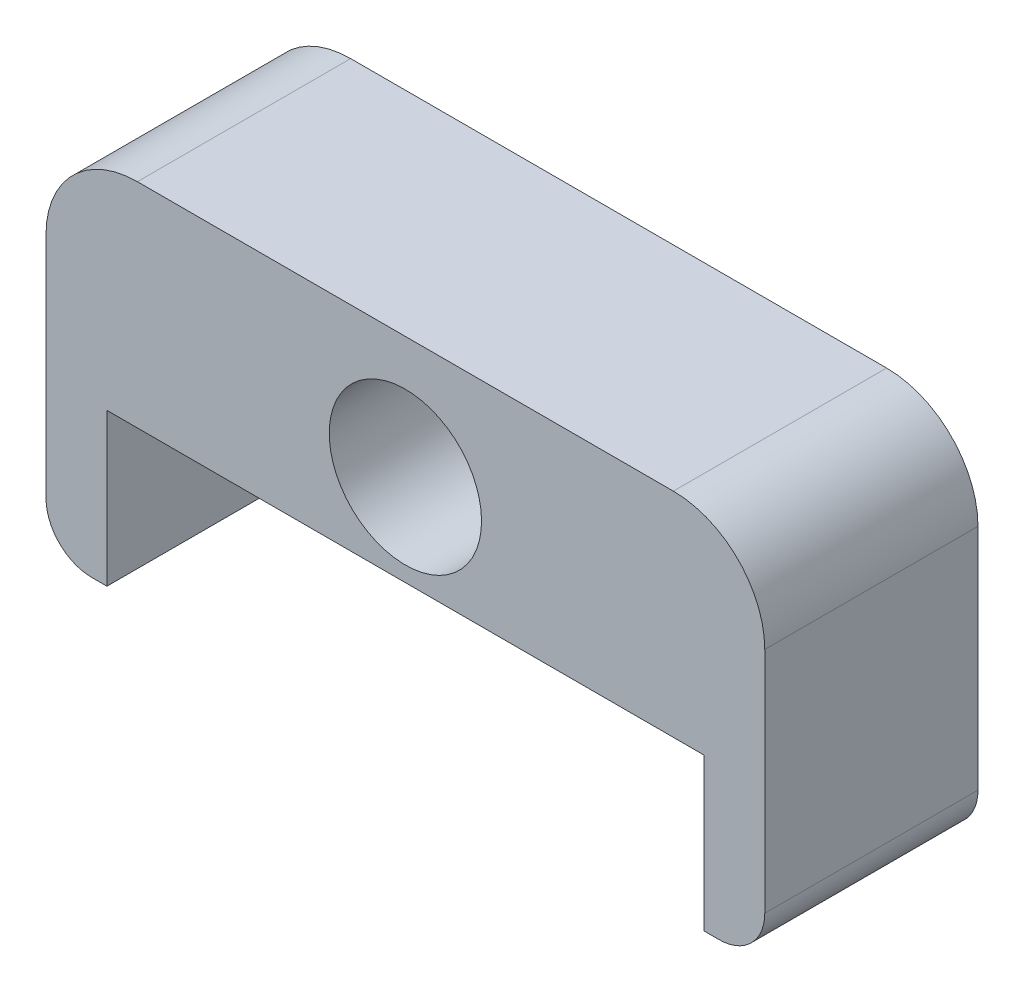
ISO-10303-21;
HEADER;
FILE_DESCRIPTION(('STEP AP214'),'2;1');
FILE_NAME('part.step','',(''),(''),'','','');
FILE_SCHEMA(('AUTOMOTIVE_DESIGN { 1 0 10303 214 1 1 1 1 }'));
ENDSEC;
DATA;
#1=APPLICATION_CONTEXT('core data for automotive mechanical design processes');
#2=APPLICATION_PROTOCOL_DEFINITION('international standard','automotive_design',2000,#1);
#3=PRODUCT_CONTEXT('',#1,'mechanical');
#4=PRODUCT('Part','Part','',(#3));
#5=PRODUCT_RELATED_PRODUCT_CATEGORY('part','',(#4));
#6=PRODUCT_DEFINITION_FORMATION('','',#4);
#7=PRODUCT_DEFINITION_CONTEXT('part definition',#1,'design');
#8=PRODUCT_DEFINITION('design','',#6,#7);
#9=PRODUCT_DEFINITION_SHAPE('','',#8);
#10=(LENGTH_UNIT() NAMED_UNIT(*) SI_UNIT(.MILLI.,.METRE.));
#11=(NAMED_UNIT(*) PLANE_ANGLE_UNIT() SI_UNIT($,.RADIAN.));
#12=(NAMED_UNIT(*) SI_UNIT($,.STERADIAN.) SOLID_ANGLE_UNIT());
#13=UNCERTAINTY_MEASURE_WITH_UNIT(LENGTH_MEASURE(1.E-05),#10,'distance_accuracy_value','');
#14=(GEOMETRIC_REPRESENTATION_CONTEXT(3) GLOBAL_UNCERTAINTY_ASSIGNED_CONTEXT((#13)) GLOBAL_UNIT_ASSIGNED_CONTEXT((#10,
#11,#12)) REPRESENTATION_CONTEXT('',''));
#15=CARTESIAN_POINT('',(0.,0.,0.));
#16=DIRECTION('',(0.,0.,1.));
#17=DIRECTION('',(1.,0.,0.));
#18=AXIS2_PLACEMENT_3D('',#15,#16,#17);
#19=CARTESIAN_POINT('',(-9.79671523,0.,-7.));
#20=DIRECTION('',(1.,0.,0.));
#21=DIRECTION('',(0.,1.,0.));
#22=AXIS2_PLACEMENT_3D('',#19,#20,#21);
#23=PLANE('',#22);
#24=DIRECTION('',(0.,1.,0.));
#25=VECTOR('',#24,1.);
#26=CARTESIAN_POINT('',(-9.79671523,0.,0.));
#27=LINE('',#26,#25);
#28=CARTESIAN_POINT('',(-9.79671523,-5.,0.));
#29=VERTEX_POINT('',#28);
#30=CARTESIAN_POINT('',(-9.79671523,0.,0.));
#31=VERTEX_POINT('',#30);
#32=EDGE_CURVE('E169',#29,#31,#27,.T.);
#33=ORIENTED_EDGE('',*,*,#32,.F.);
#34=DIRECTION('',(0.,0.,1.));
#35=VECTOR('',#34,1.);
#36=CARTESIAN_POINT('',(-9.79671523,-5.,-7.));
#37=LINE('',#36,#35);
#38=CARTESIAN_POINT('',(-9.79671523,-5.,-7.));
#39=VERTEX_POINT('',#38);
#40=EDGE_CURVE('E147',#39,#29,#37,.T.);
#41=ORIENTED_EDGE('',*,*,#40,.F.);
#42=DIRECTION('',(0.,1.,0.));
#43=VECTOR('',#42,1.);
#44=CARTESIAN_POINT('',(-9.79671523,0.,-7.));
#45=LINE('',#44,#43);
#46=CARTESIAN_POINT('',(-9.79671523,0.,-7.));
#47=VERTEX_POINT('',#46);
#48=EDGE_CURVE('E140',#39,#47,#45,.T.);
#49=ORIENTED_EDGE('',*,*,#48,.T.);
#50=DIRECTION('',(0.,0.,1.));
#51=VECTOR('',#50,1.);
#52=CARTESIAN_POINT('',(-9.79671523,0.,-7.));
#53=LINE('',#52,#51);
#54=EDGE_CURVE('E123',#47,#31,#53,.T.);
#55=ORIENTED_EDGE('',*,*,#54,.T.);
#56=EDGE_LOOP('',(#33,#41,#49,#55));
#57=FACE_BOUND('',#56,.T.);
#58=ADVANCED_FACE('F36',(#57),#23,.T.);
#59=CARTESIAN_POINT('',(-9.79671523,-5.,-7.));
#60=DIRECTION('',(0.,-1.,0.));
#61=DIRECTION('',(1.,0.,0.));
#62=AXIS2_PLACEMENT_3D('',#59,#60,#61);
#63=PLANE('',#62);
#64=DIRECTION('',(1.,0.,0.));
#65=VECTOR('',#64,1.);
#66=CARTESIAN_POINT('',(-9.79671523,-5.,0.));
#67=LINE('',#66,#65);
#68=CARTESIAN_POINT('',(-10.29671523,-5.,0.));
#69=VERTEX_POINT('',#68);
#70=EDGE_CURVE('E148',#69,#29,#67,.T.);
#71=ORIENTED_EDGE('',*,*,#70,.F.);
#72=DIRECTION('',(0.,0.,1.));
#73=VECTOR('',#72,1.);
#74=CARTESIAN_POINT('',(-10.29671523,-5.,-7.));
#75=LINE('',#74,#73);
#76=CARTESIAN_POINT('',(-10.29671523,-5.,-7.));
#77=VERTEX_POINT('',#76);
#78=EDGE_CURVE('E44',#69,#77,#75,.F.);
#79=ORIENTED_EDGE('',*,*,#78,.T.);
#80=DIRECTION('',(1.,0.,0.));
#81=VECTOR('',#80,1.);
#82=CARTESIAN_POINT('',(-9.79671523,-5.,-7.));
#83=LINE('',#82,#81);
#84=EDGE_CURVE('E134',#77,#39,#83,.T.);
#85=ORIENTED_EDGE('',*,*,#84,.T.);
#86=ORIENTED_EDGE('',*,*,#40,.T.);
#87=EDGE_LOOP('',(#71,#79,#85,#86));
#88=FACE_BOUND('',#87,.T.);
#89=ADVANCED_FACE('F267',(#88),#63,.T.);
#90=CARTESIAN_POINT('',(-11.79671523,-5.,-7.));
#91=DIRECTION('',(-1.,0.,0.));
#92=DIRECTION('',(0.,-1.,0.));
#93=AXIS2_PLACEMENT_3D('',#90,#91,#92);
#94=PLANE('',#93);
#95=DIRECTION('',(0.,-1.,0.));
#96=VECTOR('',#95,1.);
#97=CARTESIAN_POINT('',(-11.79671523,-5.,-7.));
#98=LINE('',#97,#96);
#99=CARTESIAN_POINT('',(-11.79671523,4.,-7.));
#100=VERTEX_POINT('',#99);
#101=CARTESIAN_POINT('',(-11.79671523,-3.5,-7.));
#102=VERTEX_POINT('',#101);
#103=EDGE_CURVE('E165',#100,#102,#98,.T.);
#104=ORIENTED_EDGE('',*,*,#103,.T.);
#105=DIRECTION('',(0.,0.,1.));
#106=VECTOR('',#105,1.);
#107=CARTESIAN_POINT('',(-11.79671523,-3.5,-7.));
#108=LINE('',#107,#106);
#109=CARTESIAN_POINT('',(-11.79671523,-3.5,0.));
#110=VERTEX_POINT('',#109);
#111=EDGE_CURVE('E217',#102,#110,#108,.T.);
#112=ORIENTED_EDGE('',*,*,#111,.T.);
#113=DIRECTION('',(0.,-1.,0.));
#114=VECTOR('',#113,1.);
#115=CARTESIAN_POINT('',(-11.79671523,-5.,0.));
#116=LINE('',#115,#114);
#117=CARTESIAN_POINT('',(-11.79671523,4.,0.));
#118=VERTEX_POINT('',#117);
#119=EDGE_CURVE('E150',#118,#110,#116,.T.);
#120=ORIENTED_EDGE('',*,*,#119,.F.);
#121=DIRECTION('',(0.,0.,1.));
#122=VECTOR('',#121,1.);
#123=CARTESIAN_POINT('',(-11.79671523,4.,-7.));
#124=LINE('',#123,#122);
#125=EDGE_CURVE('E204',#118,#100,#124,.F.);
#126=ORIENTED_EDGE('',*,*,#125,.T.);
#127=EDGE_LOOP('',(#104,#112,#120,#126));
#128=FACE_BOUND('',#127,.T.);
#129=ADVANCED_FACE('F223',(#128),#94,.T.);
#130=CARTESIAN_POINT('',(-11.79671523,7.,-7.));
#131=DIRECTION('',(0.,1.,0.));
#132=DIRECTION('',(-1.,0.,0.));
#133=AXIS2_PLACEMENT_3D('',#130,#131,#132);
#134=PLANE('',#133);
#135=DIRECTION('',(-1.,0.,0.));
#136=VECTOR('',#135,1.);
#137=CARTESIAN_POINT('',(-11.79671523,7.,-7.));
#138=LINE('',#137,#136);
#139=CARTESIAN_POINT('',(8.79671523,7.,-7.));
#140=VERTEX_POINT('',#139);
#141=CARTESIAN_POINT('',(-8.79671523,7.,-7.));
#142=VERTEX_POINT('',#141);
#143=EDGE_CURVE('E162',#140,#142,#138,.T.);
#144=ORIENTED_EDGE('',*,*,#143,.T.);
#145=DIRECTION('',(0.,0.,1.));
#146=VECTOR('',#145,1.);
#147=CARTESIAN_POINT('',(-8.79671523,7.,-7.));
#148=LINE('',#147,#146);
#149=CARTESIAN_POINT('',(-8.79671523,7.,0.));
#150=VERTEX_POINT('',#149);
#151=EDGE_CURVE('E199',#142,#150,#148,.T.);
#152=ORIENTED_EDGE('',*,*,#151,.T.);
#153=DIRECTION('',(-1.,0.,0.));
#154=VECTOR('',#153,1.);
#155=CARTESIAN_POINT('',(-11.79671523,7.,0.));
#156=LINE('',#155,#154);
#157=CARTESIAN_POINT('',(8.79671523,7.,0.));
#158=VERTEX_POINT('',#157);
#159=EDGE_CURVE('E181',#158,#150,#156,.T.);
#160=ORIENTED_EDGE('',*,*,#159,.F.);
#161=DIRECTION('',(0.,0.,1.));
#162=VECTOR('',#161,1.);
#163=CARTESIAN_POINT('',(8.79671523,7.,-7.));
#164=LINE('',#163,#162);
#165=EDGE_CURVE('E194',#158,#140,#164,.F.);
#166=ORIENTED_EDGE('',*,*,#165,.T.);
#167=EDGE_LOOP('',(#144,#152,#160,#166));
#168=FACE_BOUND('',#167,.T.);
#169=ADVANCED_FACE('F235',(#168),#134,.T.);
#170=CARTESIAN_POINT('',(11.79671523,-5.,-7.));
#171=DIRECTION('',(1.,0.,0.));
#172=DIRECTION('',(0.,1.,0.));
#173=AXIS2_PLACEMENT_3D('',#170,#171,#172);
#174=PLANE('',#173);
#175=DIRECTION('',(0.,1.,0.));
#176=VECTOR('',#175,1.);
#177=CARTESIAN_POINT('',(11.79671523,-5.,0.));
#178=LINE('',#177,#176);
#179=CARTESIAN_POINT('',(11.79671523,-3.5,0.));
#180=VERTEX_POINT('',#179);
#181=CARTESIAN_POINT('',(11.79671523,4.,0.));
#182=VERTEX_POINT('',#181);
#183=EDGE_CURVE('E179',#180,#182,#178,.T.);
#184=ORIENTED_EDGE('',*,*,#183,.F.);
#185=DIRECTION('',(0.,0.,1.));
#186=VECTOR('',#185,1.);
#187=CARTESIAN_POINT('',(11.79671523,-3.5,-7.));
#188=LINE('',#187,#186);
#189=CARTESIAN_POINT('',(11.79671523,-3.5,-7.));
#190=VERTEX_POINT('',#189);
#191=EDGE_CURVE('E213',#180,#190,#188,.F.);
#192=ORIENTED_EDGE('',*,*,#191,.T.);
#193=DIRECTION('',(0.,1.,0.));
#194=VECTOR('',#193,1.);
#195=CARTESIAN_POINT('',(11.79671523,-5.,-7.));
#196=LINE('',#195,#194);
#197=CARTESIAN_POINT('',(11.79671523,4.,-7.));
#198=VERTEX_POINT('',#197);
#199=EDGE_CURVE('E160',#190,#198,#196,.T.);
#200=ORIENTED_EDGE('',*,*,#199,.T.);
#201=DIRECTION('',(0.,0.,1.));
#202=VECTOR('',#201,1.);
#203=CARTESIAN_POINT('',(11.79671523,4.,-7.));
#204=LINE('',#203,#202);
#205=EDGE_CURVE('E186',#198,#182,#204,.T.);
#206=ORIENTED_EDGE('',*,*,#205,.T.);
#207=EDGE_LOOP('',(#184,#192,#200,#206));
#208=FACE_BOUND('',#207,.T.);
#209=ADVANCED_FACE('F246',(#208),#174,.T.);
#210=CARTESIAN_POINT('',(9.79671523,-5.,-7.));
#211=DIRECTION('',(0.,-1.,0.));
#212=DIRECTION('',(1.,0.,0.));
#213=AXIS2_PLACEMENT_3D('',#210,#211,#212);
#214=PLANE('',#213);
#215=DIRECTION('',(1.,0.,0.));
#216=VECTOR('',#215,1.);
#217=CARTESIAN_POINT('',(9.79671523,-5.,-7.));
#218=LINE('',#217,#216);
#219=CARTESIAN_POINT('',(9.79671523,-5.,-7.));
#220=VERTEX_POINT('',#219);
#221=CARTESIAN_POINT('',(10.29671523,-5.,-7.));
#222=VERTEX_POINT('',#221);
#223=EDGE_CURVE('E157',#220,#222,#218,.T.);
#224=ORIENTED_EDGE('',*,*,#223,.T.);
#225=DIRECTION('',(0.,0.,1.));
#226=VECTOR('',#225,1.);
#227=CARTESIAN_POINT('',(10.29671523,-5.,-7.));
#228=LINE('',#227,#226);
#229=CARTESIAN_POINT('',(10.29671523,-5.,0.));
#230=VERTEX_POINT('',#229);
#231=EDGE_CURVE('E208',#222,#230,#228,.T.);
#232=ORIENTED_EDGE('',*,*,#231,.T.);
#233=DIRECTION('',(1.,0.,0.));
#234=VECTOR('',#233,1.);
#235=CARTESIAN_POINT('',(9.79671523,-5.,0.));
#236=LINE('',#235,#234);
#237=CARTESIAN_POINT('',(9.79671523,-5.,0.));
#238=VERTEX_POINT('',#237);
#239=EDGE_CURVE('E176',#238,#230,#236,.T.);
#240=ORIENTED_EDGE('',*,*,#239,.F.);
#241=DIRECTION('',(0.,0.,1.));
#242=VECTOR('',#241,1.);
#243=CARTESIAN_POINT('',(9.79671523,-5.,-7.));
#244=LINE('',#243,#242);
#245=EDGE_CURVE('E187',#220,#238,#244,.T.);
#246=ORIENTED_EDGE('',*,*,#245,.F.);
#247=EDGE_LOOP('',(#224,#232,#240,#246));
#248=FACE_BOUND('',#247,.T.);
#249=ADVANCED_FACE('F254',(#248),#214,.T.);
#250=CARTESIAN_POINT('',(9.79671523,0.,-7.));
#251=DIRECTION('',(-1.,0.,0.));
#252=DIRECTION('',(0.,-1.,0.));
#253=AXIS2_PLACEMENT_3D('',#250,#251,#252);
#254=PLANE('',#253);
#255=DIRECTION('',(0.,-1.,0.));
#256=VECTOR('',#255,1.);
#257=CARTESIAN_POINT('',(9.79671523,0.,0.));
#258=LINE('',#257,#256);
#259=CARTESIAN_POINT('',(9.79671523,0.,0.));
#260=VERTEX_POINT('',#259);
#261=EDGE_CURVE('E173',#260,#238,#258,.T.);
#262=ORIENTED_EDGE('',*,*,#261,.F.);
#263=DIRECTION('',(0.,0.,1.));
#264=VECTOR('',#263,1.);
#265=CARTESIAN_POINT('',(9.79671523,0.,-7.));
#266=LINE('',#265,#264);
#267=CARTESIAN_POINT('',(9.79671523,0.,-7.));
#268=VERTEX_POINT('',#267);
#269=EDGE_CURVE('E133',#268,#260,#266,.T.);
#270=ORIENTED_EDGE('',*,*,#269,.F.);
#271=DIRECTION('',(0.,-1.,0.));
#272=VECTOR('',#271,1.);
#273=CARTESIAN_POINT('',(9.79671523,0.,-7.));
#274=LINE('',#273,#272);
#275=EDGE_CURVE('E143',#268,#220,#274,.T.);
#276=ORIENTED_EDGE('',*,*,#275,.T.);
#277=ORIENTED_EDGE('',*,*,#245,.T.);
#278=EDGE_LOOP('',(#262,#270,#276,#277));
#279=FACE_BOUND('',#278,.T.);
#280=ADVANCED_FACE('F257',(#279),#254,.T.);
#281=CARTESIAN_POINT('',(9.79671523,0.,-7.));
#282=DIRECTION('',(0.,-1.,0.));
#283=DIRECTION('',(1.,0.,0.));
#284=AXIS2_PLACEMENT_3D('',#281,#282,#283);
#285=PLANE('',#284);
#286=DIRECTION('',(1.,0.,0.));
#287=VECTOR('',#286,1.);
#288=CARTESIAN_POINT('',(9.79671523,0.,0.));
#289=LINE('',#288,#287);
#290=EDGE_CURVE('E128',#31,#260,#289,.T.);
#291=ORIENTED_EDGE('',*,*,#290,.F.);
#292=ORIENTED_EDGE('',*,*,#54,.F.);
#293=DIRECTION('',(1.,0.,0.));
#294=VECTOR('',#293,1.);
#295=CARTESIAN_POINT('',(9.79671523,0.,-7.));
#296=LINE('',#295,#294);
#297=EDGE_CURVE('E126',#47,#268,#296,.T.);
#298=ORIENTED_EDGE('',*,*,#297,.T.);
#299=ORIENTED_EDGE('',*,*,#269,.T.);
#300=EDGE_LOOP('',(#291,#292,#298,#299));
#301=FACE_BOUND('',#300,.T.);
#302=ADVANCED_FACE('F125',(#301),#285,.T.);
#303=CARTESIAN_POINT('',(0.,0.,-7.));
#304=DIRECTION('',(0.,0.,-1.));
#305=DIRECTION('',(-1.,0.,0.));
#306=AXIS2_PLACEMENT_3D('',#303,#304,#305);
#307=PLANE('',#306);
#308=CARTESIAN_POINT('',(0.,3.,-7.));
#309=DIRECTION('',(0.,0.,1.));
#310=DIRECTION('',(1.,0.,0.));
#311=AXIS2_PLACEMENT_3D('',#308,#309,#310);
#312=CIRCLE('',#311,2.5);
#313=CARTESIAN_POINT('',(2.5,3.,-7.));
#314=VERTEX_POINT('',#313);
#315=EDGE_CURVE('E171',#314,#314,#312,.T.);
#316=ORIENTED_EDGE('',*,*,#315,.T.);
#317=EDGE_LOOP('',(#316));
#318=FACE_BOUND('',#317,.T.);
#319=ORIENTED_EDGE('',*,*,#84,.F.);
#320=CARTESIAN_POINT('',(-10.29671523,-3.5,-7.));
#321=DIRECTION('',(0.,0.,-1.));
#322=DIRECTION('',(-1.,0.,0.));
#323=AXIS2_PLACEMENT_3D('',#320,#321,#322);
#324=CIRCLE('',#323,1.5);
#325=EDGE_CURVE('E11',#77,#102,#324,.T.);
#326=ORIENTED_EDGE('',*,*,#325,.T.);
#327=ORIENTED_EDGE('',*,*,#103,.F.);
#328=CARTESIAN_POINT('',(-8.79671523,4.,-7.));
#329=DIRECTION('',(0.,0.,-1.));
#330=DIRECTION('',(-1.,0.,0.));
#331=AXIS2_PLACEMENT_3D('',#328,#329,#330);
#332=CIRCLE('',#331,3.);
#333=EDGE_CURVE('E206',#100,#142,#332,.T.);
#334=ORIENTED_EDGE('',*,*,#333,.T.);
#335=ORIENTED_EDGE('',*,*,#143,.F.);
#336=CARTESIAN_POINT('',(8.79671523,4.,-7.));
#337=DIRECTION('',(0.,0.,-1.));
#338=DIRECTION('',(-1.,0.,0.));
#339=AXIS2_PLACEMENT_3D('',#336,#337,#338);
#340=CIRCLE('',#339,3.);
#341=EDGE_CURVE('E196',#140,#198,#340,.T.);
#342=ORIENTED_EDGE('',*,*,#341,.T.);
#343=ORIENTED_EDGE('',*,*,#199,.F.);
#344=CARTESIAN_POINT('',(10.29671523,-3.5,-7.));
#345=DIRECTION('',(0.,0.,-1.));
#346=DIRECTION('',(-1.,0.,0.));
#347=AXIS2_PLACEMENT_3D('',#344,#345,#346);
#348=CIRCLE('',#347,1.5);
#349=EDGE_CURVE('E215',#190,#222,#348,.T.);
#350=ORIENTED_EDGE('',*,*,#349,.T.);
#351=ORIENTED_EDGE('',*,*,#223,.F.);
#352=ORIENTED_EDGE('',*,*,#275,.F.);
#353=ORIENTED_EDGE('',*,*,#297,.F.);
#354=ORIENTED_EDGE('',*,*,#48,.F.);
#355=EDGE_LOOP('',(#319,#326,#327,#334,#335,#342,#343,#350,#351,#352,#353,#354));
#356=FACE_BOUND('',#355,.T.);
#357=ADVANCED_FACE('F139',(#318,#356),#307,.T.);
#358=CARTESIAN_POINT('',(0.,0.,0.));
#359=DIRECTION('',(0.,0.,-1.));
#360=DIRECTION('',(-1.,0.,0.));
#361=AXIS2_PLACEMENT_3D('',#358,#359,#360);
#362=PLANE('',#361);
#363=CARTESIAN_POINT('',(0.,3.,0.));
#364=DIRECTION('',(0.,0.,1.));
#365=DIRECTION('',(1.,0.,0.));
#366=AXIS2_PLACEMENT_3D('',#363,#364,#365);
#367=CIRCLE('',#366,2.5);
#368=CARTESIAN_POINT('',(2.5,3.,0.));
#369=VERTEX_POINT('',#368);
#370=EDGE_CURVE('E153',#369,#369,#367,.T.);
#371=ORIENTED_EDGE('',*,*,#370,.F.);
#372=EDGE_LOOP('',(#371));
#373=FACE_BOUND('',#372,.T.);
#374=ORIENTED_EDGE('',*,*,#119,.T.);
#375=CARTESIAN_POINT('',(-10.29671523,-3.5,0.));
#376=DIRECTION('',(0.,0.,-1.));
#377=DIRECTION('',(-1.,0.,0.));
#378=AXIS2_PLACEMENT_3D('',#375,#376,#377);
#379=CIRCLE('',#378,1.5);
#380=EDGE_CURVE('E58',#110,#69,#379,.F.);
#381=ORIENTED_EDGE('',*,*,#380,.T.);
#382=ORIENTED_EDGE('',*,*,#70,.T.);
#383=ORIENTED_EDGE('',*,*,#32,.T.);
#384=ORIENTED_EDGE('',*,*,#290,.T.);
#385=ORIENTED_EDGE('',*,*,#261,.T.);
#386=ORIENTED_EDGE('',*,*,#239,.T.);
#387=CARTESIAN_POINT('',(10.29671523,-3.5,0.));
#388=DIRECTION('',(0.,0.,-1.));
#389=DIRECTION('',(-1.,0.,0.));
#390=AXIS2_PLACEMENT_3D('',#387,#388,#389);
#391=CIRCLE('',#390,1.5);
#392=EDGE_CURVE('E211',#230,#180,#391,.F.);
#393=ORIENTED_EDGE('',*,*,#392,.T.);
#394=ORIENTED_EDGE('',*,*,#183,.T.);
#395=CARTESIAN_POINT('',(8.79671523,4.,0.));
#396=DIRECTION('',(0.,0.,-1.));
#397=DIRECTION('',(-1.,0.,0.));
#398=AXIS2_PLACEMENT_3D('',#395,#396,#397);
#399=CIRCLE('',#398,3.);
#400=EDGE_CURVE('E192',#182,#158,#399,.F.);
#401=ORIENTED_EDGE('',*,*,#400,.T.);
#402=ORIENTED_EDGE('',*,*,#159,.T.);
#403=CARTESIAN_POINT('',(-8.79671523,4.,0.));
#404=DIRECTION('',(0.,0.,-1.));
#405=DIRECTION('',(-1.,0.,0.));
#406=AXIS2_PLACEMENT_3D('',#403,#404,#405);
#407=CIRCLE('',#406,3.);
#408=EDGE_CURVE('E202',#150,#118,#407,.F.);
#409=ORIENTED_EDGE('',*,*,#408,.T.);
#410=EDGE_LOOP('',(#374,#381,#382,#383,#384,#385,#386,#393,#394,#401,#402,#409));
#411=FACE_BOUND('',#410,.T.);
#412=ADVANCED_FACE('F228',(#373,#411),#362,.F.);
#413=CARTESIAN_POINT('',(0.,3.,-7.));
#414=DIRECTION('',(0.,0.,1.));
#415=DIRECTION('',(1.,0.,0.));
#416=AXIS2_PLACEMENT_3D('',#413,#414,#415);
#417=CYLINDRICAL_SURFACE('',#416,2.5);
#418=ORIENTED_EDGE('',*,*,#315,.F.);
#419=EDGE_LOOP('',(#418));
#420=FACE_BOUND('',#419,.T.);
#421=ORIENTED_EDGE('',*,*,#370,.T.);
#422=EDGE_LOOP('',(#421));
#423=FACE_BOUND('',#422,.T.);
#424=ADVANCED_FACE('F276',(#420,#423),#417,.F.);
#425=CARTESIAN_POINT('',(8.79671523,4.,-7.));
#426=DIRECTION('',(0.,0.,1.));
#427=DIRECTION('',(1.,0.,0.));
#428=AXIS2_PLACEMENT_3D('',#425,#426,#427);
#429=CYLINDRICAL_SURFACE('',#428,3.);
#430=ORIENTED_EDGE('',*,*,#341,.F.);
#431=ORIENTED_EDGE('',*,*,#165,.F.);
#432=ORIENTED_EDGE('',*,*,#400,.F.);
#433=ORIENTED_EDGE('',*,*,#205,.F.);
#434=EDGE_LOOP('',(#430,#431,#432,#433));
#435=FACE_BOUND('',#434,.T.);
#436=ADVANCED_FACE('F242',(#435),#429,.T.);
#437=CARTESIAN_POINT('',(-8.79671523,4.,-7.));
#438=DIRECTION('',(0.,0.,1.));
#439=DIRECTION('',(1.,0.,0.));
#440=AXIS2_PLACEMENT_3D('',#437,#438,#439);
#441=CYLINDRICAL_SURFACE('',#440,3.);
#442=ORIENTED_EDGE('',*,*,#333,.F.);
#443=ORIENTED_EDGE('',*,*,#125,.F.);
#444=ORIENTED_EDGE('',*,*,#408,.F.);
#445=ORIENTED_EDGE('',*,*,#151,.F.);
#446=EDGE_LOOP('',(#442,#443,#444,#445));
#447=FACE_BOUND('',#446,.T.);
#448=ADVANCED_FACE('F233',(#447),#441,.T.);
#449=CARTESIAN_POINT('',(10.29671523,-3.5,-7.));
#450=DIRECTION('',(0.,0.,1.));
#451=DIRECTION('',(1.,0.,0.));
#452=AXIS2_PLACEMENT_3D('',#449,#450,#451);
#453=CYLINDRICAL_SURFACE('',#452,1.5);
#454=ORIENTED_EDGE('',*,*,#349,.F.);
#455=ORIENTED_EDGE('',*,*,#191,.F.);
#456=ORIENTED_EDGE('',*,*,#392,.F.);
#457=ORIENTED_EDGE('',*,*,#231,.F.);
#458=EDGE_LOOP('',(#454,#455,#456,#457));
#459=FACE_BOUND('',#458,.T.);
#460=ADVANCED_FACE('F251',(#459),#453,.T.);
#461=CARTESIAN_POINT('',(-10.29671523,-3.5,-7.));
#462=DIRECTION('',(0.,0.,1.));
#463=DIRECTION('',(1.,0.,0.));
#464=AXIS2_PLACEMENT_3D('',#461,#462,#463);
#465=CYLINDRICAL_SURFACE('',#464,1.5);
#466=ORIENTED_EDGE('',*,*,#325,.F.);
#467=ORIENTED_EDGE('',*,*,#78,.F.);
#468=ORIENTED_EDGE('',*,*,#380,.F.);
#469=ORIENTED_EDGE('',*,*,#111,.F.);
#470=EDGE_LOOP('',(#466,#467,#468,#469));
#471=FACE_BOUND('',#470,.T.);
#472=ADVANCED_FACE('F38',(#471),#465,.T.);
#473=CLOSED_SHELL('',(#58,#89,#129,#169,#209,#249,#280,#302,#357,#412,#424,#436,#448,#460,#472));
#474=MANIFOLD_SOLID_BREP('B2',#473);
#475=ADVANCED_BREP_SHAPE_REPRESENTATION('',(#18,#474),#14);
#476=SHAPE_DEFINITION_REPRESENTATION(#9,#475);
ENDSEC;
END-ISO-10303-21;
